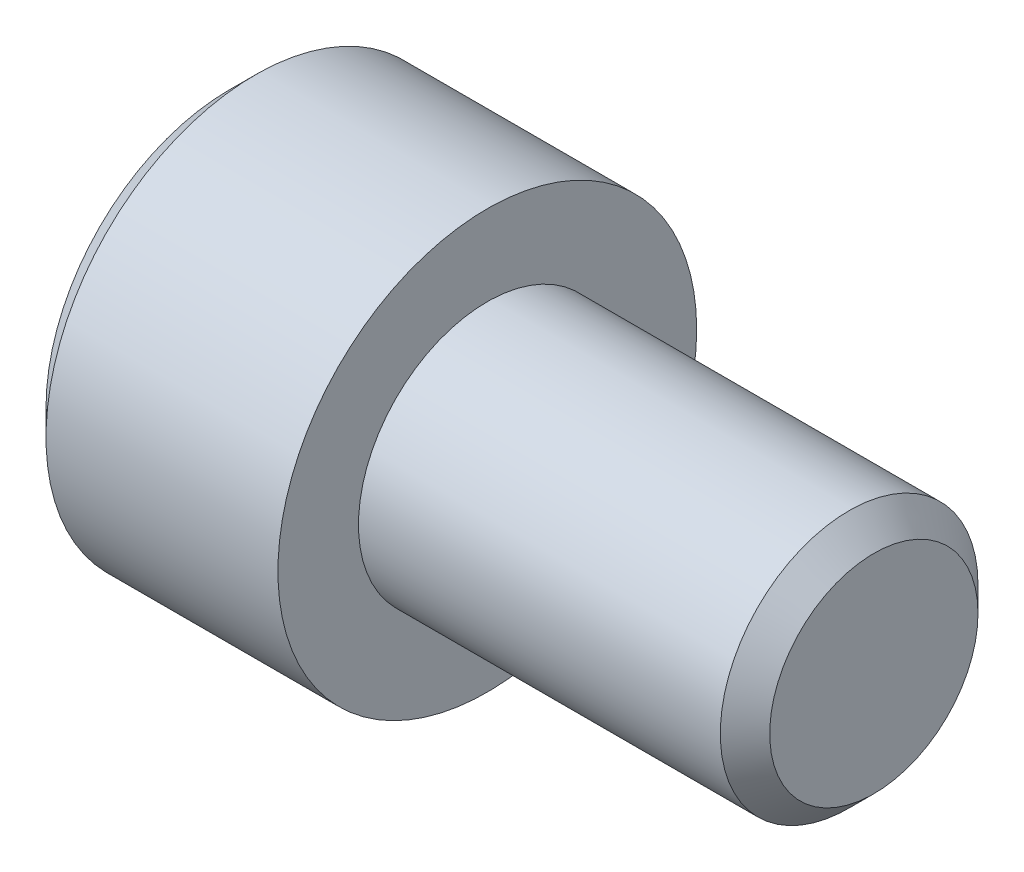
ISO-10303-21;
HEADER;
FILE_DESCRIPTION(('STEP AP214'),'2;1');
FILE_NAME('part.step','',(''),(''),'','','');
FILE_SCHEMA(('AUTOMOTIVE_DESIGN { 1 0 10303 214 1 1 1 1 }'));
ENDSEC;
DATA;
#1=APPLICATION_CONTEXT('core data for automotive mechanical design processes');
#2=APPLICATION_PROTOCOL_DEFINITION('international standard','automotive_design',2000,#1);
#3=PRODUCT_CONTEXT('',#1,'mechanical');
#4=PRODUCT('Part','Part','',(#3));
#5=PRODUCT_RELATED_PRODUCT_CATEGORY('part','',(#4));
#6=PRODUCT_DEFINITION_FORMATION('','',#4);
#7=PRODUCT_DEFINITION_CONTEXT('part definition',#1,'design');
#8=PRODUCT_DEFINITION('design','',#6,#7);
#9=PRODUCT_DEFINITION_SHAPE('','',#8);
#10=(LENGTH_UNIT() NAMED_UNIT(*) SI_UNIT(.MILLI.,.METRE.));
#11=(NAMED_UNIT(*) PLANE_ANGLE_UNIT() SI_UNIT($,.RADIAN.));
#12=(NAMED_UNIT(*) SI_UNIT($,.STERADIAN.) SOLID_ANGLE_UNIT());
#13=UNCERTAINTY_MEASURE_WITH_UNIT(LENGTH_MEASURE(1.E-05),#10,'distance_accuracy_value','');
#14=(GEOMETRIC_REPRESENTATION_CONTEXT(3) GLOBAL_UNCERTAINTY_ASSIGNED_CONTEXT((#13)) GLOBAL_UNIT_ASSIGNED_CONTEXT((#10,
#11,#12)) REPRESENTATION_CONTEXT('',''));
#15=CARTESIAN_POINT('',(0.,0.,0.));
#16=DIRECTION('',(0.,0.,1.));
#17=DIRECTION('',(1.,0.,0.));
#18=AXIS2_PLACEMENT_3D('',#15,#16,#17);
#19=CARTESIAN_POINT('',(-8.,0.,0.));
#20=DIRECTION('',(1.,0.,0.));
#21=DIRECTION('',(0.,0.,-1.));
#22=AXIS2_PLACEMENT_3D('',#19,#20,#21);
#23=PLANE('',#22);
#24=CARTESIAN_POINT('',(-8.,0.,0.));
#25=DIRECTION('',(1.,0.,0.));
#26=DIRECTION('',(0.,0.,-1.));
#27=AXIS2_PLACEMENT_3D('',#24,#25,#26);
#28=CIRCLE('',#27,5.7);
#29=CARTESIAN_POINT('',(-8.,0.,-5.7));
#30=VERTEX_POINT('',#29);
#31=EDGE_CURVE('E116',#30,#30,#28,.T.);
#32=ORIENTED_EDGE('',*,*,#31,.F.);
#33=EDGE_LOOP('',(#32));
#34=FACE_BOUND('',#33,.T.);
#35=DIRECTION('',(0.,0.500000000000001,-0.866025403784438));
#36=VECTOR('',#35,1.);
#37=CARTESIAN_POINT('',(-8.,-3.4641016151378,0.));
#38=LINE('',#37,#36);
#39=CARTESIAN_POINT('',(-8.,-3.4641016151378,0.));
#40=VERTEX_POINT('',#39);
#41=CARTESIAN_POINT('',(-8.,-1.7320508075689,-3.));
#42=VERTEX_POINT('',#41);
#43=EDGE_CURVE('E101',#40,#42,#38,.T.);
#44=ORIENTED_EDGE('',*,*,#43,.T.);
#45=DIRECTION('',(0.,1.,0.));
#46=VECTOR('',#45,1.);
#47=CARTESIAN_POINT('',(-8.,-1.7320508075689,-3.));
#48=LINE('',#47,#46);
#49=CARTESIAN_POINT('',(-8.,1.7320508075689,-3.));
#50=VERTEX_POINT('',#49);
#51=EDGE_CURVE('E89',#42,#50,#48,.T.);
#52=ORIENTED_EDGE('',*,*,#51,.T.);
#53=DIRECTION('',(0.,0.500000000000001,0.866025403784438));
#54=VECTOR('',#53,1.);
#55=CARTESIAN_POINT('',(-8.,1.7320508075689,-3.));
#56=LINE('',#55,#54);
#57=CARTESIAN_POINT('',(-8.,3.4641016151378,0.));
#58=VERTEX_POINT('',#57);
#59=EDGE_CURVE('E100',#50,#58,#56,.T.);
#60=ORIENTED_EDGE('',*,*,#59,.T.);
#61=DIRECTION('',(0.,-0.500000000000001,0.866025403784438));
#62=VECTOR('',#61,1.);
#63=CARTESIAN_POINT('',(-8.,3.4641016151378,0.));
#64=LINE('',#63,#62);
#65=CARTESIAN_POINT('',(-8.,1.7320508075689,3.));
#66=VERTEX_POINT('',#65);
#67=EDGE_CURVE('E126',#58,#66,#64,.T.);
#68=ORIENTED_EDGE('',*,*,#67,.T.);
#69=DIRECTION('',(0.,-1.,0.));
#70=VECTOR('',#69,1.);
#71=CARTESIAN_POINT('',(-8.,1.7320508075689,3.));
#72=LINE('',#71,#70);
#73=CARTESIAN_POINT('',(-8.,-1.7320508075689,3.));
#74=VERTEX_POINT('',#73);
#75=EDGE_CURVE('E131',#66,#74,#72,.T.);
#76=ORIENTED_EDGE('',*,*,#75,.T.);
#77=DIRECTION('',(0.,-0.500000000000001,-0.866025403784438));
#78=VECTOR('',#77,1.);
#79=CARTESIAN_POINT('',(-8.,-1.7320508075689,3.));
#80=LINE('',#79,#78);
#81=EDGE_CURVE('E115',#74,#40,#80,.T.);
#82=ORIENTED_EDGE('',*,*,#81,.T.);
#83=EDGE_LOOP('',(#44,#52,#60,#68,#76,#82));
#84=FACE_BOUND('',#83,.T.);
#85=ADVANCED_FACE('F17',(#34,#84),#23,.F.);
#86=CARTESIAN_POINT('',(-8.,0.,0.));
#87=DIRECTION('',(1.,0.,0.));
#88=DIRECTION('',(0.,0.,-1.));
#89=AXIS2_PLACEMENT_3D('',#86,#87,#88);
#90=CONICAL_SURFACE('',#89,5.7,0.785398163397449);
#91=CARTESIAN_POINT('',(-7.2,0.,0.));
#92=DIRECTION('',(1.,0.,0.));
#93=DIRECTION('',(0.,0.,-1.));
#94=AXIS2_PLACEMENT_3D('',#91,#92,#93);
#95=CIRCLE('',#94,6.5);
#96=CARTESIAN_POINT('',(-7.2,0.,-6.5));
#97=VERTEX_POINT('',#96);
#98=EDGE_CURVE('E138',#97,#97,#95,.T.);
#99=ORIENTED_EDGE('',*,*,#98,.F.);
#100=EDGE_LOOP('',(#99));
#101=FACE_BOUND('',#100,.T.);
#102=ORIENTED_EDGE('',*,*,#31,.T.);
#103=EDGE_LOOP('',(#102));
#104=FACE_BOUND('',#103,.T.);
#105=ADVANCED_FACE('F280',(#101,#104),#90,.T.);
#106=CARTESIAN_POINT('',(-4.,-3.4641016151378,0.));
#107=DIRECTION('',(0.,0.866025403784438,0.500000000000001));
#108=DIRECTION('',(0.,-0.500000000000001,0.866025403784438));
#109=AXIS2_PLACEMENT_3D('',#106,#107,#108);
#110=PLANE('',#109);
#111=ORIENTED_EDGE('',*,*,#43,.F.);
#112=DIRECTION('',(-1.,0.,0.));
#113=VECTOR('',#112,1.);
#114=CARTESIAN_POINT('',(-4.,-3.4641016151378,0.));
#115=LINE('',#114,#113);
#116=CARTESIAN_POINT('',(-4.,-3.4641016151378,0.));
#117=VERTEX_POINT('',#116);
#118=EDGE_CURVE('E143',#117,#40,#115,.T.);
#119=ORIENTED_EDGE('',*,*,#118,.F.);
#120=DIRECTION('',(0.,0.500000000000001,-0.866025403784438));
#121=VECTOR('',#120,1.);
#122=CARTESIAN_POINT('',(-4.,-3.4641016151378,0.));
#123=LINE('',#122,#121);
#124=CARTESIAN_POINT('',(-4.,-2.5980762113533,-1.5));
#125=VERTEX_POINT('',#124);
#126=EDGE_CURVE('E145',#117,#125,#123,.T.);
#127=ORIENTED_EDGE('',*,*,#126,.T.);
#128=DIRECTION('',(0.,0.500000000000001,-0.866025403784438));
#129=VECTOR('',#128,1.);
#130=CARTESIAN_POINT('',(-4.,-2.59807621135334,-1.50000000000002));
#131=LINE('',#130,#129);
#132=CARTESIAN_POINT('',(-4.,-1.7320508075689,-3.));
#133=VERTEX_POINT('',#132);
#134=EDGE_CURVE('E110',#125,#133,#131,.T.);
#135=ORIENTED_EDGE('',*,*,#134,.T.);
#136=DIRECTION('',(-1.,0.,0.));
#137=VECTOR('',#136,1.);
#138=CARTESIAN_POINT('',(-4.,-1.7320508075689,-3.));
#139=LINE('',#138,#137);
#140=EDGE_CURVE('E93',#133,#42,#139,.T.);
#141=ORIENTED_EDGE('',*,*,#140,.T.);
#142=EDGE_LOOP('',(#111,#119,#127,#135,#141));
#143=FACE_BOUND('',#142,.T.);
#144=ADVANCED_FACE('F106',(#143),#110,.T.);
#145=CARTESIAN_POINT('',(-4.,-1.7320508075689,-3.));
#146=DIRECTION('',(0.,0.,1.));
#147=DIRECTION('',(1.,0.,0.));
#148=AXIS2_PLACEMENT_3D('',#145,#146,#147);
#149=PLANE('',#148);
#150=ORIENTED_EDGE('',*,*,#51,.F.);
#151=ORIENTED_EDGE('',*,*,#140,.F.);
#152=DIRECTION('',(0.,1.,0.));
#153=VECTOR('',#152,1.);
#154=CARTESIAN_POINT('',(-4.,-1.7320508075689,-3.));
#155=LINE('',#154,#153);
#156=CARTESIAN_POINT('',(-4.,0.,-3.));
#157=VERTEX_POINT('',#156);
#158=EDGE_CURVE('E111',#133,#157,#155,.T.);
#159=ORIENTED_EDGE('',*,*,#158,.T.);
#160=DIRECTION('',(0.,1.,0.));
#161=VECTOR('',#160,1.);
#162=CARTESIAN_POINT('',(-4.,0.,-3.));
#163=LINE('',#162,#161);
#164=CARTESIAN_POINT('',(-4.,1.7320508075689,-3.));
#165=VERTEX_POINT('',#164);
#166=EDGE_CURVE('E157',#157,#165,#163,.T.);
#167=ORIENTED_EDGE('',*,*,#166,.T.);
#168=DIRECTION('',(-1.,0.,0.));
#169=VECTOR('',#168,1.);
#170=CARTESIAN_POINT('',(-4.,1.7320508075689,-3.));
#171=LINE('',#170,#169);
#172=EDGE_CURVE('E96',#165,#50,#171,.T.);
#173=ORIENTED_EDGE('',*,*,#172,.T.);
#174=EDGE_LOOP('',(#150,#151,#159,#167,#173));
#175=FACE_BOUND('',#174,.T.);
#176=ADVANCED_FACE('F91',(#175),#149,.T.);
#177=CARTESIAN_POINT('',(-4.,1.7320508075689,-3.));
#178=DIRECTION('',(0.,-0.866025403784438,0.500000000000001));
#179=DIRECTION('',(0.,-0.500000000000001,-0.866025403784438));
#180=AXIS2_PLACEMENT_3D('',#177,#178,#179);
#181=PLANE('',#180);
#182=ORIENTED_EDGE('',*,*,#59,.F.);
#183=ORIENTED_EDGE('',*,*,#172,.F.);
#184=DIRECTION('',(0.,0.500000000000001,0.866025403784438));
#185=VECTOR('',#184,1.);
#186=CARTESIAN_POINT('',(-4.,1.7320508075689,-3.));
#187=LINE('',#186,#185);
#188=CARTESIAN_POINT('',(-4.,2.59807621135334,-1.50000000000003));
#189=VERTEX_POINT('',#188);
#190=EDGE_CURVE('E164',#165,#189,#187,.T.);
#191=ORIENTED_EDGE('',*,*,#190,.T.);
#192=DIRECTION('',(0.,0.500000000000001,0.866025403784438));
#193=VECTOR('',#192,1.);
#194=CARTESIAN_POINT('',(-4.,2.59807621135333,-1.50000000000002));
#195=LINE('',#194,#193);
#196=CARTESIAN_POINT('',(-4.,3.4641016151378,0.));
#197=VERTEX_POINT('',#196);
#198=EDGE_CURVE('E169',#189,#197,#195,.T.);
#199=ORIENTED_EDGE('',*,*,#198,.T.);
#200=DIRECTION('',(-1.,0.,0.));
#201=VECTOR('',#200,1.);
#202=CARTESIAN_POINT('',(-4.,3.4641016151378,0.));
#203=LINE('',#202,#201);
#204=EDGE_CURVE('E174',#197,#58,#203,.T.);
#205=ORIENTED_EDGE('',*,*,#204,.T.);
#206=EDGE_LOOP('',(#182,#183,#191,#199,#205));
#207=FACE_BOUND('',#206,.T.);
#208=ADVANCED_FACE('F296',(#207),#181,.T.);
#209=CARTESIAN_POINT('',(-4.,3.4641016151378,0.));
#210=DIRECTION('',(0.,-0.866025403784438,-0.500000000000001));
#211=DIRECTION('',(0.,0.500000000000001,-0.866025403784438));
#212=AXIS2_PLACEMENT_3D('',#209,#210,#211);
#213=PLANE('',#212);
#214=ORIENTED_EDGE('',*,*,#67,.F.);
#215=ORIENTED_EDGE('',*,*,#204,.F.);
#216=DIRECTION('',(0.,-0.500000000000001,0.866025403784438));
#217=VECTOR('',#216,1.);
#218=CARTESIAN_POINT('',(-4.,3.4641016151378,0.));
#219=LINE('',#218,#217);
#220=CARTESIAN_POINT('',(-4.,2.59807621135334,1.50000000000003));
#221=VERTEX_POINT('',#220);
#222=EDGE_CURVE('E179',#197,#221,#219,.T.);
#223=ORIENTED_EDGE('',*,*,#222,.T.);
#224=DIRECTION('',(0.,-0.500000000000001,0.866025403784438));
#225=VECTOR('',#224,1.);
#226=CARTESIAN_POINT('',(-4.,2.59807621135334,1.50000000000003));
#227=LINE('',#226,#225);
#228=CARTESIAN_POINT('',(-4.,1.7320508075689,3.));
#229=VERTEX_POINT('',#228);
#230=EDGE_CURVE('E184',#221,#229,#227,.T.);
#231=ORIENTED_EDGE('',*,*,#230,.T.);
#232=DIRECTION('',(-1.,0.,0.));
#233=VECTOR('',#232,1.);
#234=CARTESIAN_POINT('',(-4.,1.7320508075689,3.));
#235=LINE('',#234,#233);
#236=EDGE_CURVE('E189',#229,#66,#235,.T.);
#237=ORIENTED_EDGE('',*,*,#236,.T.);
#238=EDGE_LOOP('',(#214,#215,#223,#231,#237));
#239=FACE_BOUND('',#238,.T.);
#240=ADVANCED_FACE('F299',(#239),#213,.T.);
#241=CARTESIAN_POINT('',(-4.,1.7320508075689,3.));
#242=DIRECTION('',(0.,0.,-1.));
#243=DIRECTION('',(-1.,0.,0.));
#244=AXIS2_PLACEMENT_3D('',#241,#242,#243);
#245=PLANE('',#244);
#246=ORIENTED_EDGE('',*,*,#75,.F.);
#247=ORIENTED_EDGE('',*,*,#236,.F.);
#248=DIRECTION('',(0.,-1.,0.));
#249=VECTOR('',#248,1.);
#250=CARTESIAN_POINT('',(-4.,1.7320508075689,3.));
#251=LINE('',#250,#249);
#252=CARTESIAN_POINT('',(-4.,0.,3.));
#253=VERTEX_POINT('',#252);
#254=EDGE_CURVE('E194',#229,#253,#251,.T.);
#255=ORIENTED_EDGE('',*,*,#254,.T.);
#256=DIRECTION('',(0.,-1.,0.));
#257=VECTOR('',#256,1.);
#258=CARTESIAN_POINT('',(-4.,0.,3.));
#259=LINE('',#258,#257);
#260=CARTESIAN_POINT('',(-4.,-1.7320508075689,3.));
#261=VERTEX_POINT('',#260);
#262=EDGE_CURVE('E199',#253,#261,#259,.T.);
#263=ORIENTED_EDGE('',*,*,#262,.T.);
#264=DIRECTION('',(-1.,0.,0.));
#265=VECTOR('',#264,1.);
#266=CARTESIAN_POINT('',(-4.,-1.7320508075689,3.));
#267=LINE('',#266,#265);
#268=EDGE_CURVE('E204',#261,#74,#267,.T.);
#269=ORIENTED_EDGE('',*,*,#268,.T.);
#270=EDGE_LOOP('',(#246,#247,#255,#263,#269));
#271=FACE_BOUND('',#270,.T.);
#272=ADVANCED_FACE('F303',(#271),#245,.T.);
#273=CARTESIAN_POINT('',(-4.,-1.7320508075689,3.));
#274=DIRECTION('',(0.,0.866025403784438,-0.500000000000001));
#275=DIRECTION('',(0.,0.500000000000001,0.866025403784438));
#276=AXIS2_PLACEMENT_3D('',#273,#274,#275);
#277=PLANE('',#276);
#278=ORIENTED_EDGE('',*,*,#81,.F.);
#279=ORIENTED_EDGE('',*,*,#268,.F.);
#280=DIRECTION('',(0.,-0.500000000000001,-0.866025403784438));
#281=VECTOR('',#280,1.);
#282=CARTESIAN_POINT('',(-4.,-1.7320508075689,3.));
#283=LINE('',#282,#281);
#284=CARTESIAN_POINT('',(-4.,-2.59807621135334,1.50000000000003));
#285=VERTEX_POINT('',#284);
#286=EDGE_CURVE('E209',#261,#285,#283,.T.);
#287=ORIENTED_EDGE('',*,*,#286,.T.);
#288=DIRECTION('',(0.,-0.500000000000001,-0.866025403784438));
#289=VECTOR('',#288,1.);
#290=CARTESIAN_POINT('',(-4.,-2.59807621135333,1.50000000000002));
#291=LINE('',#290,#289);
#292=EDGE_CURVE('E214',#285,#117,#291,.T.);
#293=ORIENTED_EDGE('',*,*,#292,.T.);
#294=ORIENTED_EDGE('',*,*,#118,.T.);
#295=EDGE_LOOP('',(#278,#279,#287,#293,#294));
#296=FACE_BOUND('',#295,.T.);
#297=ADVANCED_FACE('F276',(#296),#277,.T.);
#298=CARTESIAN_POINT('',(12.,0.,0.));
#299=DIRECTION('',(1.,0.,0.));
#300=DIRECTION('',(0.,0.,-1.));
#301=AXIS2_PLACEMENT_3D('',#298,#299,#300);
#302=CYLINDRICAL_SURFACE('',#301,6.5);
#303=CARTESIAN_POINT('',(0.,0.,0.));
#304=DIRECTION('',(1.,0.,0.));
#305=DIRECTION('',(0.,0.,-1.));
#306=AXIS2_PLACEMENT_3D('',#303,#304,#305);
#307=CIRCLE('',#306,6.5);
#308=CARTESIAN_POINT('',(0.,0.,-6.5));
#309=VERTEX_POINT('',#308);
#310=EDGE_CURVE('E219',#309,#309,#307,.T.);
#311=ORIENTED_EDGE('',*,*,#310,.F.);
#312=EDGE_LOOP('',(#311));
#313=FACE_BOUND('',#312,.T.);
#314=ORIENTED_EDGE('',*,*,#98,.T.);
#315=EDGE_LOOP('',(#314));
#316=FACE_BOUND('',#315,.T.);
#317=ADVANCED_FACE('F272',(#313,#316),#302,.T.);
#318=CARTESIAN_POINT('',(-4.,0.,0.));
#319=DIRECTION('',(1.,0.,0.));
#320=DIRECTION('',(0.,0.,-1.));
#321=AXIS2_PLACEMENT_3D('',#318,#319,#320);
#322=PLANE('',#321);
#323=CARTESIAN_POINT('',(-4.,0.,0.));
#324=DIRECTION('',(1.,0.,0.));
#325=DIRECTION('',(0.,-0.866025403784436,0.500000000000005));
#326=AXIS2_PLACEMENT_3D('',#323,#324,#325);
#327=CIRCLE('',#326,3.);
#328=EDGE_CURVE('E35',#285,#125,#327,.T.);
#329=ORIENTED_EDGE('',*,*,#328,.T.);
#330=ORIENTED_EDGE('',*,*,#126,.F.);
#331=ORIENTED_EDGE('',*,*,#292,.F.);
#332=EDGE_LOOP('',(#329,#330,#331));
#333=FACE_BOUND('',#332,.T.);
#334=ADVANCED_FACE('F275',(#333),#322,.F.);
#335=CARTESIAN_POINT('',(-4.,0.,0.));
#336=DIRECTION('',(1.,0.,0.));
#337=DIRECTION('',(0.,-0.866025403784438,-0.500000000000002));
#338=AXIS2_PLACEMENT_3D('',#335,#336,#337);
#339=CIRCLE('',#338,3.);
#340=EDGE_CURVE('E225',#125,#157,#339,.T.);
#341=ORIENTED_EDGE('',*,*,#340,.T.);
#342=ORIENTED_EDGE('',*,*,#158,.F.);
#343=ORIENTED_EDGE('',*,*,#134,.F.);
#344=EDGE_LOOP('',(#341,#342,#343));
#345=FACE_BOUND('',#344,.T.);
#346=ADVANCED_FACE('F312',(#345),#322,.F.);
#347=CARTESIAN_POINT('',(-4.,0.,0.));
#348=DIRECTION('',(1.,0.,0.));
#349=DIRECTION('',(0.,0.,-1.));
#350=AXIS2_PLACEMENT_3D('',#347,#348,#349);
#351=CIRCLE('',#350,3.);
#352=EDGE_CURVE('E230',#157,#189,#351,.T.);
#353=ORIENTED_EDGE('',*,*,#352,.T.);
#354=ORIENTED_EDGE('',*,*,#190,.F.);
#355=ORIENTED_EDGE('',*,*,#166,.F.);
#356=EDGE_LOOP('',(#353,#354,#355));
#357=FACE_BOUND('',#356,.T.);
#358=ADVANCED_FACE('F409',(#357),#322,.F.);
#359=ORIENTED_EDGE('',*,*,#198,.F.);
#360=CARTESIAN_POINT('',(-4.,0.,0.));
#361=DIRECTION('',(1.,0.,0.));
#362=DIRECTION('',(0.,0.866025403784436,-0.500000000000005));
#363=AXIS2_PLACEMENT_3D('',#360,#361,#362);
#364=CIRCLE('',#363,3.);
#365=EDGE_CURVE('E235',#189,#221,#364,.T.);
#366=ORIENTED_EDGE('',*,*,#365,.T.);
#367=ORIENTED_EDGE('',*,*,#222,.F.);
#368=EDGE_LOOP('',(#359,#366,#367));
#369=FACE_BOUND('',#368,.T.);
#370=ADVANCED_FACE('F400',(#369),#322,.F.);
#371=CARTESIAN_POINT('',(-4.,0.,0.));
#372=DIRECTION('',(1.,0.,0.));
#373=DIRECTION('',(0.,0.866025403784436,0.500000000000005));
#374=AXIS2_PLACEMENT_3D('',#371,#372,#373);
#375=CIRCLE('',#374,3.);
#376=EDGE_CURVE('E240',#221,#253,#375,.T.);
#377=ORIENTED_EDGE('',*,*,#376,.T.);
#378=ORIENTED_EDGE('',*,*,#254,.F.);
#379=ORIENTED_EDGE('',*,*,#230,.F.);
#380=EDGE_LOOP('',(#377,#378,#379));
#381=FACE_BOUND('',#380,.T.);
#382=ADVANCED_FACE('F391',(#381),#322,.F.);
#383=CARTESIAN_POINT('',(-4.,0.,0.));
#384=DIRECTION('',(1.,0.,0.));
#385=DIRECTION('',(0.,0.,1.));
#386=AXIS2_PLACEMENT_3D('',#383,#384,#385);
#387=CIRCLE('',#386,3.);
#388=EDGE_CURVE('E245',#253,#285,#387,.T.);
#389=ORIENTED_EDGE('',*,*,#388,.T.);
#390=ORIENTED_EDGE('',*,*,#286,.F.);
#391=ORIENTED_EDGE('',*,*,#262,.F.);
#392=EDGE_LOOP('',(#389,#390,#391));
#393=FACE_BOUND('',#392,.T.);
#394=ADVANCED_FACE('F268',(#393),#322,.F.);
#395=CARTESIAN_POINT('',(0.,6.5,0.));
#396=DIRECTION('',(-1.,0.,0.));
#397=DIRECTION('',(0.,0.,1.));
#398=AXIS2_PLACEMENT_3D('',#395,#396,#397);
#399=PLANE('',#398);
#400=CARTESIAN_POINT('',(0.,0.,0.));
#401=DIRECTION('',(1.,0.,0.));
#402=DIRECTION('',(0.,0.,-1.));
#403=AXIS2_PLACEMENT_3D('',#400,#401,#402);
#404=CIRCLE('',#403,4.);
#405=CARTESIAN_POINT('',(0.,0.,-4.));
#406=VERTEX_POINT('',#405);
#407=EDGE_CURVE('E249',#406,#406,#404,.T.);
#408=ORIENTED_EDGE('',*,*,#407,.F.);
#409=EDGE_LOOP('',(#408));
#410=FACE_BOUND('',#409,.T.);
#411=ORIENTED_EDGE('',*,*,#310,.T.);
#412=EDGE_LOOP('',(#411));
#413=FACE_BOUND('',#412,.T.);
#414=ADVANCED_FACE('F265',(#410,#413),#399,.F.);
#415=CARTESIAN_POINT('',(-4.,0.,0.));
#416=DIRECTION('',(-1.,0.,0.));
#417=DIRECTION('',(0.,0.,1.));
#418=AXIS2_PLACEMENT_3D('',#415,#416,#417);
#419=CONICAL_SURFACE('',#418,3.,1.30899693899574);
#420=CARTESIAN_POINT('',(-3.1961524227066,0.,0.));
#421=VERTEX_POINT('',#420);
#422=VERTEX_LOOP('',#421);
#423=FACE_BOUND('',#422,.T.);
#424=ORIENTED_EDGE('',*,*,#365,.F.);
#425=ORIENTED_EDGE('',*,*,#352,.F.);
#426=ORIENTED_EDGE('',*,*,#340,.F.);
#427=ORIENTED_EDGE('',*,*,#328,.F.);
#428=ORIENTED_EDGE('',*,*,#388,.F.);
#429=ORIENTED_EDGE('',*,*,#376,.F.);
#430=EDGE_LOOP('',(#424,#425,#426,#427,#428,#429));
#431=FACE_BOUND('',#430,.T.);
#432=ADVANCED_FACE('F261',(#423,#431),#419,.F.);
#433=CARTESIAN_POINT('',(12.,0.,0.));
#434=DIRECTION('',(1.,0.,0.));
#435=DIRECTION('',(0.,0.,-1.));
#436=AXIS2_PLACEMENT_3D('',#433,#434,#435);
#437=CYLINDRICAL_SURFACE('',#436,4.);
#438=CARTESIAN_POINT('',(11.233,0.,0.));
#439=DIRECTION('',(1.,0.,0.));
#440=DIRECTION('',(0.,0.,-1.));
#441=AXIS2_PLACEMENT_3D('',#438,#439,#440);
#442=CIRCLE('',#441,4.);
#443=CARTESIAN_POINT('',(11.233,0.,-4.));
#444=VERTEX_POINT('',#443);
#445=EDGE_CURVE('E25',#444,#444,#442,.T.);
#446=ORIENTED_EDGE('',*,*,#445,.F.);
#447=EDGE_LOOP('',(#446));
#448=FACE_BOUND('',#447,.T.);
#449=ORIENTED_EDGE('',*,*,#407,.T.);
#450=EDGE_LOOP('',(#449));
#451=FACE_BOUND('',#450,.T.);
#452=ADVANCED_FACE('F258',(#448,#451),#437,.T.);
#453=CARTESIAN_POINT('',(11.233,0.,0.));
#454=DIRECTION('',(-1.,0.,0.));
#455=DIRECTION('',(0.,0.,1.));
#456=AXIS2_PLACEMENT_3D('',#453,#454,#455);
#457=CONICAL_SURFACE('',#456,4.,0.785398163397448);
#458=CARTESIAN_POINT('',(12.,0.,0.));
#459=DIRECTION('',(1.,0.,0.));
#460=DIRECTION('',(0.,0.,-1.));
#461=AXIS2_PLACEMENT_3D('',#458,#459,#460);
#462=CIRCLE('',#461,3.233);
#463=CARTESIAN_POINT('',(12.,0.,-3.233));
#464=VERTEX_POINT('',#463);
#465=EDGE_CURVE('E11',#464,#464,#462,.T.);
#466=ORIENTED_EDGE('',*,*,#465,.F.);
#467=EDGE_LOOP('',(#466));
#468=FACE_BOUND('',#467,.T.);
#469=ORIENTED_EDGE('',*,*,#445,.T.);
#470=EDGE_LOOP('',(#469));
#471=FACE_BOUND('',#470,.T.);
#472=ADVANCED_FACE('F256',(#468,#471),#457,.T.);
#473=CARTESIAN_POINT('',(12.,3.233,0.));
#474=DIRECTION('',(-1.,0.,0.));
#475=DIRECTION('',(0.,0.,1.));
#476=AXIS2_PLACEMENT_3D('',#473,#474,#475);
#477=PLANE('',#476);
#478=ORIENTED_EDGE('',*,*,#465,.T.);
#479=EDGE_LOOP('',(#478));
#480=FACE_BOUND('',#479,.T.);
#481=ADVANCED_FACE('F19',(#480),#477,.F.);
#482=CLOSED_SHELL('',(#85,#105,#144,#176,#208,#240,#272,#297,#317,#334,#346,#358,#370,#382,#394,
#414,#432,#452,#472,#481));
#483=MANIFOLD_SOLID_BREP('B1',#482);
#484=ADVANCED_BREP_SHAPE_REPRESENTATION('',(#18,#483),#14);
#485=SHAPE_DEFINITION_REPRESENTATION(#9,#484);
ENDSEC;
END-ISO-10303-21;
